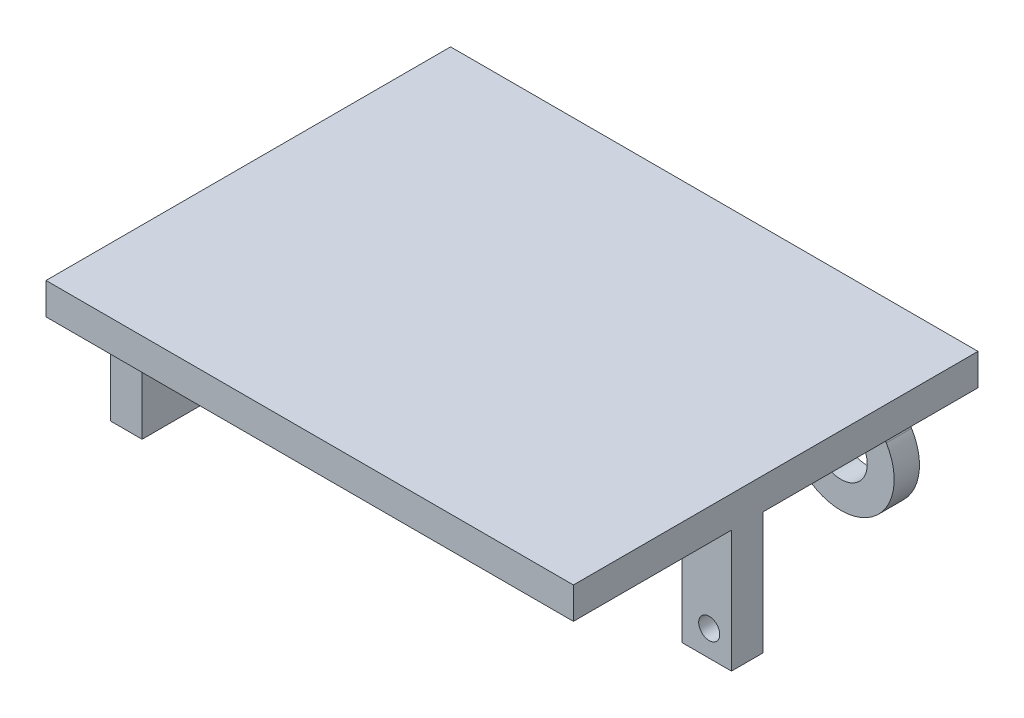
ISO-10303-21;
HEADER;
FILE_DESCRIPTION(('STEP AP214'),'2;1');
FILE_NAME('part.step','',(''),(''),'','','');
FILE_SCHEMA(('AUTOMOTIVE_DESIGN { 1 0 10303 214 1 1 1 1 }'));
ENDSEC;
DATA;
#1=APPLICATION_CONTEXT('core data for automotive mechanical design processes');
#2=APPLICATION_PROTOCOL_DEFINITION('international standard','automotive_design',2000,#1);
#3=PRODUCT_CONTEXT('',#1,'mechanical');
#4=PRODUCT('Part','Part','',(#3));
#5=PRODUCT_RELATED_PRODUCT_CATEGORY('part','',(#4));
#6=PRODUCT_DEFINITION_FORMATION('','',#4);
#7=PRODUCT_DEFINITION_CONTEXT('part definition',#1,'design');
#8=PRODUCT_DEFINITION('design','',#6,#7);
#9=PRODUCT_DEFINITION_SHAPE('','',#8);
#10=(LENGTH_UNIT() NAMED_UNIT(*) SI_UNIT(.MILLI.,.METRE.));
#11=(NAMED_UNIT(*) PLANE_ANGLE_UNIT() SI_UNIT($,.RADIAN.));
#12=(NAMED_UNIT(*) SI_UNIT($,.STERADIAN.) SOLID_ANGLE_UNIT());
#13=UNCERTAINTY_MEASURE_WITH_UNIT(LENGTH_MEASURE(1.E-05),#10,'distance_accuracy_value','');
#14=(GEOMETRIC_REPRESENTATION_CONTEXT(3) GLOBAL_UNCERTAINTY_ASSIGNED_CONTEXT((#13)) GLOBAL_UNIT_ASSIGNED_CONTEXT((#10,
#11,#12)) REPRESENTATION_CONTEXT('',''));
#15=CARTESIAN_POINT('',(0.,0.,0.));
#16=DIRECTION('',(0.,0.,1.));
#17=DIRECTION('',(1.,0.,0.));
#18=AXIS2_PLACEMENT_3D('',#15,#16,#17);
#19=CARTESIAN_POINT('',(0.375600944053645,9.13290377750628,2.4));
#20=DIRECTION('',(0.,1.,0.));
#21=DIRECTION('',(0.,0.,1.));
#22=AXIS2_PLACEMENT_3D('',#19,#20,#21);
#23=PLANE('',#22);
#24=DIRECTION('',(-1.,0.,0.));
#25=VECTOR('',#24,1.);
#26=CARTESIAN_POINT('',(-24.690248118354,9.13290377750628,20.4));
#27=LINE('',#26,#25);
#28=CARTESIAN_POINT('',(-17.6902481183561,9.13290377750628,20.4));
#29=VERTEX_POINT('',#28);
#30=CARTESIAN_POINT('',(-24.690248118354,9.13290377750628,20.4));
#31=VERTEX_POINT('',#30);
#32=EDGE_CURVE('E281',#29,#31,#27,.T.);
#33=ORIENTED_EDGE('',*,*,#32,.T.);
#34=DIRECTION('',(0.,0.,1.));
#35=VECTOR('',#34,1.);
#36=CARTESIAN_POINT('',(-24.690248118354,9.13290377750628,20.4));
#37=LINE('',#36,#35);
#38=CARTESIAN_POINT('',(-24.690248118354,9.13290377750628,23.4));
#39=VERTEX_POINT('',#38);
#40=EDGE_CURVE('E294',#31,#39,#37,.T.);
#41=ORIENTED_EDGE('',*,*,#40,.T.);
#42=DIRECTION('',(-1.,0.,0.));
#43=VECTOR('',#42,1.);
#44=CARTESIAN_POINT('',(-24.690248118354,9.13290377750628,23.4));
#45=LINE('',#44,#43);
#46=CARTESIAN_POINT('',(-17.6902481183561,9.13290377750628,23.4));
#47=VERTEX_POINT('',#46);
#48=EDGE_CURVE('E276',#47,#39,#45,.T.);
#49=ORIENTED_EDGE('',*,*,#48,.F.);
#50=DIRECTION('',(0.,0.,1.));
#51=VECTOR('',#50,1.);
#52=CARTESIAN_POINT('',(-17.6902481183561,9.13290377750628,20.4));
#53=LINE('',#52,#51);
#54=EDGE_CURVE('E298',#29,#47,#53,.T.);
#55=ORIENTED_EDGE('',*,*,#54,.F.);
#56=EDGE_LOOP('',(#33,#41,#49,#55));
#57=FACE_BOUND('',#56,.T.);
#58=DIRECTION('',(-1.,0.,0.));
#59=VECTOR('',#58,1.);
#60=CARTESIAN_POINT('',(-36.4472483248975,9.13290377750629,13.075983));
#61=LINE('',#60,#59);
#62=CARTESIAN_POINT('',(-36.4472483248975,9.13290377750628,13.075983));
#63=VERTEX_POINT('',#62);
#64=CARTESIAN_POINT('',(-39.4472483248975,9.13290377750628,13.075983));
#65=VERTEX_POINT('',#64);
#66=EDGE_CURVE('E55',#63,#65,#61,.T.);
#67=ORIENTED_EDGE('',*,*,#66,.F.);
#68=DIRECTION('',(0.,0.,1.));
#69=VECTOR('',#68,1.);
#70=CARTESIAN_POINT('',(-36.4472483248975,9.13290377750629,6.124016));
#71=LINE('',#70,#69);
#72=CARTESIAN_POINT('',(-36.4472483248975,9.13290377750628,6.12401599999998));
#73=VERTEX_POINT('',#72);
#74=EDGE_CURVE('E60',#73,#63,#71,.T.);
#75=ORIENTED_EDGE('',*,*,#74,.F.);
#76=DIRECTION('',(-1.,0.,0.));
#77=VECTOR('',#76,1.);
#78=CARTESIAN_POINT('',(-36.4472483248975,9.13290377750629,6.124016));
#79=LINE('',#78,#77);
#80=CARTESIAN_POINT('',(-39.4472483248975,9.13290377750629,6.124016));
#81=VERTEX_POINT('',#80);
#82=EDGE_CURVE('E221',#73,#81,#79,.T.);
#83=ORIENTED_EDGE('',*,*,#82,.T.);
#84=DIRECTION('',(0.,0.,-1.));
#85=VECTOR('',#84,1.);
#86=CARTESIAN_POINT('',(-39.4472483248975,9.13290377750628,2.4));
#87=LINE('',#86,#85);
#88=CARTESIAN_POINT('',(-39.4472483248975,9.13290377750628,0.));
#89=VERTEX_POINT('',#88);
#90=EDGE_CURVE('E397',#81,#89,#87,.T.);
#91=ORIENTED_EDGE('',*,*,#90,.T.);
#92=DIRECTION('',(1.,0.,0.));
#93=VECTOR('',#92,1.);
#94=CARTESIAN_POINT('',(-39.4472483248975,9.13290377750628,0.));
#95=LINE('',#94,#93);
#96=CARTESIAN_POINT('',(-13.4706940053491,9.13290377750628,0.));
#97=VERTEX_POINT('',#96);
#98=EDGE_CURVE('E372',#89,#97,#95,.T.);
#99=ORIENTED_EDGE('',*,*,#98,.T.);
#100=DIRECTION('',(0.,0.,-1.));
#101=VECTOR('',#100,1.);
#102=CARTESIAN_POINT('',(-13.4706940053491,9.13290377750628,2.4));
#103=LINE('',#102,#101);
#104=CARTESIAN_POINT('',(-13.4706940053491,9.13290377750628,2.4));
#105=VERTEX_POINT('',#104);
#106=EDGE_CURVE('E394',#105,#97,#103,.T.);
#107=ORIENTED_EDGE('',*,*,#106,.F.);
#108=DIRECTION('',(1.,0.,0.));
#109=VECTOR('',#108,1.);
#110=CARTESIAN_POINT('',(-39.4472483248975,9.13290377750628,2.4));
#111=LINE('',#110,#109);
#112=CARTESIAN_POINT('',(0.375600944053645,9.13290377750628,2.4));
#113=VERTEX_POINT('',#112);
#114=EDGE_CURVE('E11',#105,#113,#111,.T.);
#115=ORIENTED_EDGE('',*,*,#114,.T.);
#116=DIRECTION('',(0.,0.,-1.));
#117=VECTOR('',#116,1.);
#118=CARTESIAN_POINT('',(0.375600944053645,9.13290377750628,2.4));
#119=LINE('',#118,#117);
#120=CARTESIAN_POINT('',(0.375600944053645,9.13290377750628,0.));
#121=VERTEX_POINT('',#120);
#122=EDGE_CURVE('E385',#113,#121,#119,.T.);
#123=ORIENTED_EDGE('',*,*,#122,.T.);
#124=DIRECTION('',(1.,0.,0.));
#125=VECTOR('',#124,1.);
#126=CARTESIAN_POINT('',(0.375600944053645,9.13290377750628,0.));
#127=LINE('',#126,#125);
#128=CARTESIAN_POINT('',(10.6097508816418,9.13290377750628,0.));
#129=VERTEX_POINT('',#128);
#130=EDGE_CURVE('E360',#121,#129,#127,.T.);
#131=ORIENTED_EDGE('',*,*,#130,.T.);
#132=DIRECTION('',(0.,0.,-1.));
#133=VECTOR('',#132,1.);
#134=CARTESIAN_POINT('',(10.6097508816418,9.13290377750628,2.4));
#135=LINE('',#134,#133);
#136=CARTESIAN_POINT('',(10.6097508816418,9.13290377750628,20.4));
#137=VERTEX_POINT('',#136);
#138=EDGE_CURVE('E364',#137,#129,#135,.T.);
#139=ORIENTED_EDGE('',*,*,#138,.F.);
#140=DIRECTION('',(-1.,0.,0.));
#141=VECTOR('',#140,1.);
#142=CARTESIAN_POINT('',(5.90975088164212,9.13290377750628,20.4));
#143=LINE('',#142,#141);
#144=CARTESIAN_POINT('',(5.90975088164212,9.13290377750628,20.4));
#145=VERTEX_POINT('',#144);
#146=EDGE_CURVE('E319',#137,#145,#143,.T.);
#147=ORIENTED_EDGE('',*,*,#146,.T.);
#148=DIRECTION('',(0.,0.,1.));
#149=VECTOR('',#148,1.);
#150=CARTESIAN_POINT('',(5.90975088164212,9.13290377750628,20.4));
#151=LINE('',#150,#149);
#152=CARTESIAN_POINT('',(5.90975088164212,9.13290377750628,23.4));
#153=VERTEX_POINT('',#152);
#154=EDGE_CURVE('E332',#145,#153,#151,.T.);
#155=ORIENTED_EDGE('',*,*,#154,.T.);
#156=DIRECTION('',(-1.,0.,0.));
#157=VECTOR('',#156,1.);
#158=CARTESIAN_POINT('',(5.90975088164212,9.13290377750628,23.4));
#159=LINE('',#158,#157);
#160=CARTESIAN_POINT('',(10.6097508816418,9.13290377750628,23.4));
#161=VERTEX_POINT('',#160);
#162=EDGE_CURVE('E314',#161,#153,#159,.T.);
#163=ORIENTED_EDGE('',*,*,#162,.F.);
#164=CARTESIAN_POINT('',(10.6097508816418,9.13290377750628,38.4));
#165=VERTEX_POINT('',#164);
#166=EDGE_CURVE('E382',#165,#161,#135,.T.);
#167=ORIENTED_EDGE('',*,*,#166,.F.);
#168=DIRECTION('',(1.,0.,0.));
#169=VECTOR('',#168,1.);
#170=CARTESIAN_POINT('',(-39.4472483248975,9.13290377750628,38.4));
#171=LINE('',#170,#169);
#172=CARTESIAN_POINT('',(-39.4472483248975,9.13290377750628,38.4));
#173=VERTEX_POINT('',#172);
#174=EDGE_CURVE('E341',#173,#165,#171,.T.);
#175=ORIENTED_EDGE('',*,*,#174,.F.);
#176=CARTESIAN_POINT('',(-39.4472483248975,9.13290377750628,32.275984));
#177=VERTEX_POINT('',#176);
#178=EDGE_CURVE('E398',#173,#177,#87,.T.);
#179=ORIENTED_EDGE('',*,*,#178,.T.);
#180=DIRECTION('',(-1.,0.,0.));
#181=VECTOR('',#180,1.);
#182=CARTESIAN_POINT('',(-36.4472483248975,9.13290377750628,32.275984));
#183=LINE('',#182,#181);
#184=CARTESIAN_POINT('',(-36.4472483248975,9.13290377750628,32.275984));
#185=VERTEX_POINT('',#184);
#186=EDGE_CURVE('E256',#185,#177,#183,.T.);
#187=ORIENTED_EDGE('',*,*,#186,.F.);
#188=DIRECTION('',(0.,0.,1.));
#189=VECTOR('',#188,1.);
#190=CARTESIAN_POINT('',(-36.4472483248975,9.13290377750628,32.275984));
#191=LINE('',#190,#189);
#192=CARTESIAN_POINT('',(-36.4472483248975,9.13290377750628,25.324017));
#193=VERTEX_POINT('',#192);
#194=EDGE_CURVE('E242',#193,#185,#191,.T.);
#195=ORIENTED_EDGE('',*,*,#194,.F.);
#196=DIRECTION('',(-1.,0.,0.));
#197=VECTOR('',#196,1.);
#198=CARTESIAN_POINT('',(-36.4472483248975,9.13290377750628,25.324017));
#199=LINE('',#198,#197);
#200=CARTESIAN_POINT('',(-39.4472483248975,9.13290377750628,25.324017));
#201=VERTEX_POINT('',#200);
#202=EDGE_CURVE('E259',#193,#201,#199,.T.);
#203=ORIENTED_EDGE('',*,*,#202,.T.);
#204=EDGE_CURVE('E400',#201,#65,#87,.T.);
#205=ORIENTED_EDGE('',*,*,#204,.T.);
#206=EDGE_LOOP('',(#67,#75,#83,#91,#99,#107,#115,#123,#131,#139,#147,#155,#163,#167,#175,#179,
#187,#195,#203,#205));
#207=FACE_BOUND('',#206,.T.);
#208=ADVANCED_FACE('F39',(#57,#207),#23,.F.);
#209=CARTESIAN_POINT('',(-1.02695629777827E-12,-8.59013381260265E-13,2.4));
#210=DIRECTION('',(0.,0.,1.));
#211=DIRECTION('',(1.,0.,0.));
#212=AXIS2_PLACEMENT_3D('',#209,#210,#211);
#213=PLANE('',#212);
#214=ORIENTED_EDGE('',*,*,#114,.F.);
#215=DIRECTION('',(0.616631037907866,-0.787252286810694,0.));
#216=VECTOR('',#215,1.);
#217=CARTESIAN_POINT('',(-13.4706940053491,9.13290377750628,2.4));
#218=LINE('',#217,#216);
#219=CARTESIAN_POINT('',(-3.35801161441651,-3.77794865876277,2.4));
#220=VERTEX_POINT('',#219);
#221=EDGE_CURVE('E357',#105,#220,#218,.T.);
#222=ORIENTED_EDGE('',*,*,#221,.T.);
#223=CARTESIAN_POINT('',(-1.02695629777827E-12,-8.59013381260265E-13,2.4));
#224=DIRECTION('',(0.,0.,1.));
#225=DIRECTION('',(1.,0.,0.));
#226=AXIS2_PLACEMENT_3D('',#223,#224,#225);
#227=CIRCLE('',#226,5.0546155215595);
#228=CARTESIAN_POINT('',(4.30431290479305,2.64991103405545,2.4));
#229=VERTEX_POINT('',#228);
#230=EDGE_CURVE('E359',#220,#229,#227,.T.);
#231=ORIENTED_EDGE('',*,*,#230,.T.);
#232=DIRECTION('',(-0.518265579164981,0.855219731678816,0.));
#233=VECTOR('',#232,1.);
#234=CARTESIAN_POINT('',(4.30431290479305,2.64991103405545,2.4));
#235=LINE('',#234,#233);
#236=EDGE_CURVE('E362',#229,#113,#235,.T.);
#237=ORIENTED_EDGE('',*,*,#236,.T.);
#238=EDGE_LOOP('',(#214,#222,#231,#237));
#239=FACE_BOUND('',#238,.T.);
#240=CARTESIAN_POINT('',(-1.02695629777827E-12,-8.59013381260265E-13,2.4));
#241=DIRECTION('',(0.,0.,1.));
#242=DIRECTION('',(1.,0.,0.));
#243=AXIS2_PLACEMENT_3D('',#240,#241,#242);
#244=CIRCLE('',#243,2.49999999999947);
#245=CARTESIAN_POINT('',(2.49999999999844,-8.59013381260265E-13,2.4));
#246=VERTEX_POINT('',#245);
#247=EDGE_CURVE('E351',#246,#246,#244,.T.);
#248=ORIENTED_EDGE('',*,*,#247,.F.);
#249=EDGE_LOOP('',(#248));
#250=FACE_BOUND('',#249,.T.);
#251=ADVANCED_FACE('F434',(#239,#250),#213,.T.);
#252=CARTESIAN_POINT('',(-1.02695629777827E-12,-8.59013381260265E-13,0.));
#253=DIRECTION('',(0.,0.,1.));
#254=DIRECTION('',(1.,0.,0.));
#255=AXIS2_PLACEMENT_3D('',#252,#253,#254);
#256=PLANE('',#255);
#257=DIRECTION('',(0.,1.,0.));
#258=VECTOR('',#257,1.);
#259=CARTESIAN_POINT('',(10.6097508816418,9.13290377750628,0.));
#260=LINE('',#259,#258);
#261=CARTESIAN_POINT('',(10.6097508816418,12.1289037733501,0.));
#262=VERTEX_POINT('',#261);
#263=EDGE_CURVE('E354',#129,#262,#260,.T.);
#264=ORIENTED_EDGE('',*,*,#263,.F.);
#265=ORIENTED_EDGE('',*,*,#130,.F.);
#266=DIRECTION('',(-0.518265579164981,0.855219731678816,0.));
#267=VECTOR('',#266,1.);
#268=CARTESIAN_POINT('',(4.30431290479305,2.64991103405545,0.));
#269=LINE('',#268,#267);
#270=CARTESIAN_POINT('',(4.30431290479305,2.64991103405545,0.));
#271=VERTEX_POINT('',#270);
#272=EDGE_CURVE('E378',#271,#121,#269,.T.);
#273=ORIENTED_EDGE('',*,*,#272,.F.);
#274=CARTESIAN_POINT('',(-1.02695629777827E-12,-8.59013381260265E-13,0.));
#275=DIRECTION('',(0.,0.,1.));
#276=DIRECTION('',(1.,0.,0.));
#277=AXIS2_PLACEMENT_3D('',#274,#275,#276);
#278=CIRCLE('',#277,5.0546155215595);
#279=CARTESIAN_POINT('',(-3.35801161441651,-3.77794865876277,0.));
#280=VERTEX_POINT('',#279);
#281=EDGE_CURVE('E376',#280,#271,#278,.T.);
#282=ORIENTED_EDGE('',*,*,#281,.F.);
#283=DIRECTION('',(0.616631037907866,-0.787252286810694,0.));
#284=VECTOR('',#283,1.);
#285=CARTESIAN_POINT('',(-13.4706940053491,9.13290377750628,0.));
#286=LINE('',#285,#284);
#287=EDGE_CURVE('E374',#97,#280,#286,.T.);
#288=ORIENTED_EDGE('',*,*,#287,.F.);
#289=ORIENTED_EDGE('',*,*,#98,.F.);
#290=DIRECTION('',(0.,-1.,0.));
#291=VECTOR('',#290,1.);
#292=CARTESIAN_POINT('',(-39.4472483248975,12.1289037733501,0.));
#293=LINE('',#292,#291);
#294=CARTESIAN_POINT('',(-39.4472483248975,12.1289037733501,0.));
#295=VERTEX_POINT('',#294);
#296=EDGE_CURVE('E369',#295,#89,#293,.T.);
#297=ORIENTED_EDGE('',*,*,#296,.F.);
#298=DIRECTION('',(-1.,0.,0.));
#299=VECTOR('',#298,1.);
#300=CARTESIAN_POINT('',(-39.4472483248975,12.1289037733501,0.));
#301=LINE('',#300,#299);
#302=EDGE_CURVE('E367',#262,#295,#301,.T.);
#303=ORIENTED_EDGE('',*,*,#302,.F.);
#304=EDGE_LOOP('',(#264,#265,#273,#282,#288,#289,#297,#303));
#305=FACE_BOUND('',#304,.T.);
#306=CARTESIAN_POINT('',(-1.02695629777827E-12,-8.59013381260265E-13,0.));
#307=DIRECTION('',(0.,0.,1.));
#308=DIRECTION('',(1.,0.,0.));
#309=AXIS2_PLACEMENT_3D('',#306,#307,#308);
#310=CIRCLE('',#309,2.49999999999947);
#311=CARTESIAN_POINT('',(2.49999999999844,-8.59013381260265E-13,0.));
#312=VERTEX_POINT('',#311);
#313=EDGE_CURVE('E349',#312,#312,#310,.T.);
#314=ORIENTED_EDGE('',*,*,#313,.T.);
#315=EDGE_LOOP('',(#314));
#316=FACE_BOUND('',#315,.T.);
#317=ADVANCED_FACE('F415',(#305,#316),#256,.F.);
#318=CARTESIAN_POINT('',(10.6097508816418,9.13290377750628,2.4));
#319=DIRECTION('',(-1.,0.,0.));
#320=DIRECTION('',(0.,0.,1.));
#321=AXIS2_PLACEMENT_3D('',#318,#319,#320);
#322=PLANE('',#321);
#323=ORIENTED_EDGE('',*,*,#263,.T.);
#324=DIRECTION('',(0.,0.,-1.));
#325=VECTOR('',#324,1.);
#326=CARTESIAN_POINT('',(10.6097508816418,12.1289037733501,2.4));
#327=LINE('',#326,#325);
#328=CARTESIAN_POINT('',(10.6097508816418,12.1289037733501,38.4));
#329=VERTEX_POINT('',#328);
#330=EDGE_CURVE('E43',#329,#262,#327,.T.);
#331=ORIENTED_EDGE('',*,*,#330,.F.);
#332=DIRECTION('',(0.,1.,0.));
#333=VECTOR('',#332,1.);
#334=CARTESIAN_POINT('',(10.6097508816418,9.13290377750628,38.4));
#335=LINE('',#334,#333);
#336=EDGE_CURVE('E344',#165,#329,#335,.T.);
#337=ORIENTED_EDGE('',*,*,#336,.F.);
#338=ORIENTED_EDGE('',*,*,#166,.T.);
#339=DIRECTION('',(0.,1.,0.));
#340=VECTOR('',#339,1.);
#341=CARTESIAN_POINT('',(10.6097508816418,9.13290377750628,23.4));
#342=LINE('',#341,#340);
#343=CARTESIAN_POINT('',(10.6097508816418,-2.45709622249371,23.4));
#344=VERTEX_POINT('',#343);
#345=EDGE_CURVE('E328',#344,#161,#342,.T.);
#346=ORIENTED_EDGE('',*,*,#345,.F.);
#347=DIRECTION('',(0.,0.,1.));
#348=VECTOR('',#347,1.);
#349=CARTESIAN_POINT('',(10.6097508816418,-2.45709622249371,20.4));
#350=LINE('',#349,#348);
#351=CARTESIAN_POINT('',(10.6097508816418,-2.45709622249371,20.4));
#352=VERTEX_POINT('',#351);
#353=EDGE_CURVE('E336',#352,#344,#350,.T.);
#354=ORIENTED_EDGE('',*,*,#353,.F.);
#355=DIRECTION('',(0.,1.,0.));
#356=VECTOR('',#355,1.);
#357=CARTESIAN_POINT('',(10.6097508816418,9.13290377750628,20.4));
#358=LINE('',#357,#356);
#359=EDGE_CURVE('E317',#352,#137,#358,.T.);
#360=ORIENTED_EDGE('',*,*,#359,.T.);
#361=ORIENTED_EDGE('',*,*,#138,.T.);
#362=EDGE_LOOP('',(#323,#331,#337,#338,#346,#354,#360,#361));
#363=FACE_BOUND('',#362,.T.);
#364=ADVANCED_FACE('F41',(#363),#322,.F.);
#365=CARTESIAN_POINT('',(-39.4472483248975,12.1289037733501,2.4));
#366=DIRECTION('',(0.,-1.,0.));
#367=DIRECTION('',(0.,0.,-1.));
#368=AXIS2_PLACEMENT_3D('',#365,#366,#367);
#369=PLANE('',#368);
#370=ORIENTED_EDGE('',*,*,#302,.T.);
#371=DIRECTION('',(0.,0.,-1.));
#372=VECTOR('',#371,1.);
#373=CARTESIAN_POINT('',(-39.4472483248975,12.1289037733501,2.4));
#374=LINE('',#373,#372);
#375=CARTESIAN_POINT('',(-39.4472483248975,12.1289037733501,38.4));
#376=VERTEX_POINT('',#375);
#377=EDGE_CURVE('E399',#376,#295,#374,.T.);
#378=ORIENTED_EDGE('',*,*,#377,.F.);
#379=DIRECTION('',(-1.,0.,0.));
#380=VECTOR('',#379,1.);
#381=CARTESIAN_POINT('',(10.6097508816418,12.1289037733501,38.4));
#382=LINE('',#381,#380);
#383=EDGE_CURVE('E347',#329,#376,#382,.T.);
#384=ORIENTED_EDGE('',*,*,#383,.F.);
#385=ORIENTED_EDGE('',*,*,#330,.T.);
#386=EDGE_LOOP('',(#370,#378,#384,#385));
#387=FACE_BOUND('',#386,.T.);
#388=ADVANCED_FACE('F408',(#387),#369,.F.);
#389=CARTESIAN_POINT('',(-39.4472483248975,12.1289037733501,2.4));
#390=DIRECTION('',(1.,0.,0.));
#391=DIRECTION('',(0.,0.,-1.));
#392=AXIS2_PLACEMENT_3D('',#389,#390,#391);
#393=PLANE('',#392);
#394=ORIENTED_EDGE('',*,*,#296,.T.);
#395=ORIENTED_EDGE('',*,*,#90,.F.);
#396=DIRECTION('',(0.,1.,0.));
#397=VECTOR('',#396,1.);
#398=CARTESIAN_POINT('',(-39.4472483248975,-2.49109835249372,6.12401599999998));
#399=LINE('',#398,#397);
#400=CARTESIAN_POINT('',(-39.4472483248975,-2.49109835249372,6.12401599999998));
#401=VERTEX_POINT('',#400);
#402=EDGE_CURVE('E228',#401,#81,#399,.T.);
#403=ORIENTED_EDGE('',*,*,#402,.F.);
#404=DIRECTION('',(0.,0.,-1.));
#405=VECTOR('',#404,1.);
#406=CARTESIAN_POINT('',(-39.4472483248975,-2.49109835249372,13.075983));
#407=LINE('',#406,#405);
#408=CARTESIAN_POINT('',(-39.4472483248975,-2.49109835249372,13.075983));
#409=VERTEX_POINT('',#408);
#410=EDGE_CURVE('E226',#409,#401,#407,.T.);
#411=ORIENTED_EDGE('',*,*,#410,.F.);
#412=DIRECTION('',(0.,-1.,0.));
#413=VECTOR('',#412,1.);
#414=CARTESIAN_POINT('',(-39.4472483248975,-2.49109835249372,13.075983));
#415=LINE('',#414,#413);
#416=EDGE_CURVE('E211',#65,#409,#415,.T.);
#417=ORIENTED_EDGE('',*,*,#416,.F.);
#418=ORIENTED_EDGE('',*,*,#204,.F.);
#419=DIRECTION('',(0.,1.,0.));
#420=VECTOR('',#419,1.);
#421=CARTESIAN_POINT('',(-39.4472483248975,-2.49109835249372,25.324017));
#422=LINE('',#421,#420);
#423=CARTESIAN_POINT('',(-39.4472483248975,-2.49109835249372,25.324017));
#424=VERTEX_POINT('',#423);
#425=EDGE_CURVE('E250',#424,#201,#422,.T.);
#426=ORIENTED_EDGE('',*,*,#425,.F.);
#427=DIRECTION('',(0.,0.,-1.));
#428=VECTOR('',#427,1.);
#429=CARTESIAN_POINT('',(-39.4472483248975,-2.49109835249372,32.275984));
#430=LINE('',#429,#428);
#431=CARTESIAN_POINT('',(-39.4472483248975,-2.49109835249372,32.275984));
#432=VERTEX_POINT('',#431);
#433=EDGE_CURVE('E234',#432,#424,#430,.T.);
#434=ORIENTED_EDGE('',*,*,#433,.F.);
#435=DIRECTION('',(0.,-1.,0.));
#436=VECTOR('',#435,1.);
#437=CARTESIAN_POINT('',(-39.4472483248975,-2.49109835249372,32.275984));
#438=LINE('',#437,#436);
#439=EDGE_CURVE('E239',#177,#432,#438,.T.);
#440=ORIENTED_EDGE('',*,*,#439,.F.);
#441=ORIENTED_EDGE('',*,*,#178,.F.);
#442=DIRECTION('',(0.,-1.,0.));
#443=VECTOR('',#442,1.);
#444=CARTESIAN_POINT('',(-39.4472483248975,12.1289037733501,38.4));
#445=LINE('',#444,#443);
#446=EDGE_CURVE('E335',#376,#173,#445,.T.);
#447=ORIENTED_EDGE('',*,*,#446,.F.);
#448=ORIENTED_EDGE('',*,*,#377,.T.);
#449=EDGE_LOOP('',(#394,#395,#403,#411,#417,#418,#426,#434,#440,#441,#447,#448));
#450=FACE_BOUND('',#449,.T.);
#451=ADVANCED_FACE('F420',(#450),#393,.F.);
#452=CARTESIAN_POINT('',(-13.4706940053491,9.13290377750628,2.4));
#453=DIRECTION('',(0.787252286810694,0.616631037907866,0.));
#454=DIRECTION('',(-0.616631037907866,0.787252286810694,0.));
#455=AXIS2_PLACEMENT_3D('',#452,#453,#454);
#456=PLANE('',#455);
#457=ORIENTED_EDGE('',*,*,#287,.T.);
#458=DIRECTION('',(0.,0.,-1.));
#459=VECTOR('',#458,1.);
#460=CARTESIAN_POINT('',(-3.35801161441651,-3.77794865876277,2.4));
#461=LINE('',#460,#459);
#462=EDGE_CURVE('E391',#220,#280,#461,.T.);
#463=ORIENTED_EDGE('',*,*,#462,.F.);
#464=ORIENTED_EDGE('',*,*,#221,.F.);
#465=ORIENTED_EDGE('',*,*,#106,.T.);
#466=EDGE_LOOP('',(#457,#463,#464,#465));
#467=FACE_BOUND('',#466,.T.);
#468=ADVANCED_FACE('F454',(#467),#456,.F.);
#469=CARTESIAN_POINT('',(-1.02695629777827E-12,-8.59013381260265E-13,2.4));
#470=DIRECTION('',(0.,0.,-1.));
#471=DIRECTION('',(-1.,0.,0.));
#472=AXIS2_PLACEMENT_3D('',#469,#470,#471);
#473=CYLINDRICAL_SURFACE('',#472,5.0546155215595);
#474=ORIENTED_EDGE('',*,*,#281,.T.);
#475=DIRECTION('',(0.,0.,-1.));
#476=VECTOR('',#475,1.);
#477=CARTESIAN_POINT('',(4.30431290479305,2.64991103405545,2.4));
#478=LINE('',#477,#476);
#479=EDGE_CURVE('E388',#229,#271,#478,.T.);
#480=ORIENTED_EDGE('',*,*,#479,.F.);
#481=ORIENTED_EDGE('',*,*,#230,.F.);
#482=ORIENTED_EDGE('',*,*,#462,.T.);
#483=EDGE_LOOP('',(#474,#480,#481,#482));
#484=FACE_BOUND('',#483,.T.);
#485=ADVANCED_FACE('F450',(#484),#473,.T.);
#486=CARTESIAN_POINT('',(4.30431290479305,2.64991103405545,2.4));
#487=DIRECTION('',(-0.855219731678816,-0.518265579164981,0.));
#488=DIRECTION('',(0.518265579164981,-0.855219731678817,0.));
#489=AXIS2_PLACEMENT_3D('',#486,#487,#488);
#490=PLANE('',#489);
#491=ORIENTED_EDGE('',*,*,#272,.T.);
#492=ORIENTED_EDGE('',*,*,#122,.F.);
#493=ORIENTED_EDGE('',*,*,#236,.F.);
#494=ORIENTED_EDGE('',*,*,#479,.T.);
#495=EDGE_LOOP('',(#491,#492,#493,#494));
#496=FACE_BOUND('',#495,.T.);
#497=ADVANCED_FACE('F446',(#496),#490,.F.);
#498=CARTESIAN_POINT('',(-1.02695629777827E-12,-8.59013381260265E-13,2.4));
#499=DIRECTION('',(0.,0.,-1.));
#500=DIRECTION('',(-1.,0.,0.));
#501=AXIS2_PLACEMENT_3D('',#498,#499,#500);
#502=CYLINDRICAL_SURFACE('',#501,2.49999999999947);
#503=ORIENTED_EDGE('',*,*,#247,.T.);
#504=EDGE_LOOP('',(#503));
#505=FACE_BOUND('',#504,.T.);
#506=ORIENTED_EDGE('',*,*,#313,.F.);
#507=EDGE_LOOP('',(#506));
#508=FACE_BOUND('',#507,.T.);
#509=ADVANCED_FACE('F449',(#505,#508),#502,.F.);
#510=CARTESIAN_POINT('',(0.,0.,38.4));
#511=DIRECTION('',(0.,0.,1.));
#512=DIRECTION('',(1.,0.,0.));
#513=AXIS2_PLACEMENT_3D('',#510,#511,#512);
#514=PLANE('',#513);
#515=ORIENTED_EDGE('',*,*,#446,.T.);
#516=ORIENTED_EDGE('',*,*,#174,.T.);
#517=ORIENTED_EDGE('',*,*,#336,.T.);
#518=ORIENTED_EDGE('',*,*,#383,.T.);
#519=EDGE_LOOP('',(#515,#516,#517,#518));
#520=FACE_BOUND('',#519,.T.);
#521=ADVANCED_FACE('F485',(#520),#514,.T.);
#522=CARTESIAN_POINT('',(5.90975088164212,9.13290377750628,20.4));
#523=DIRECTION('',(-1.,0.,0.));
#524=DIRECTION('',(0.,-1.,0.));
#525=AXIS2_PLACEMENT_3D('',#522,#523,#524);
#526=PLANE('',#525);
#527=DIRECTION('',(0.,-1.,0.));
#528=VECTOR('',#527,1.);
#529=CARTESIAN_POINT('',(5.90975088164212,9.13290377750628,23.4));
#530=LINE('',#529,#528);
#531=CARTESIAN_POINT('',(5.90975088164213,-2.45709622249371,23.4));
#532=VERTEX_POINT('',#531);
#533=EDGE_CURVE('E307',#153,#532,#530,.T.);
#534=ORIENTED_EDGE('',*,*,#533,.F.);
#535=ORIENTED_EDGE('',*,*,#154,.F.);
#536=DIRECTION('',(0.,-1.,0.));
#537=VECTOR('',#536,1.);
#538=CARTESIAN_POINT('',(5.90975088164212,9.13290377750628,20.4));
#539=LINE('',#538,#537);
#540=CARTESIAN_POINT('',(5.90975088164213,-2.45709622249371,20.4));
#541=VERTEX_POINT('',#540);
#542=EDGE_CURVE('E310',#145,#541,#539,.T.);
#543=ORIENTED_EDGE('',*,*,#542,.T.);
#544=DIRECTION('',(0.,0.,1.));
#545=VECTOR('',#544,1.);
#546=CARTESIAN_POINT('',(5.90975088164213,-2.45709622249371,20.4));
#547=LINE('',#546,#545);
#548=EDGE_CURVE('E322',#541,#532,#547,.T.);
#549=ORIENTED_EDGE('',*,*,#548,.T.);
#550=EDGE_LOOP('',(#534,#535,#543,#549));
#551=FACE_BOUND('',#550,.T.);
#552=ADVANCED_FACE('F527',(#551),#526,.T.);
#553=CARTESIAN_POINT('',(5.90975088164213,-2.45709622249371,20.4));
#554=DIRECTION('',(0.,-1.,0.));
#555=DIRECTION('',(1.,0.,0.));
#556=AXIS2_PLACEMENT_3D('',#553,#554,#555);
#557=PLANE('',#556);
#558=DIRECTION('',(1.,0.,0.));
#559=VECTOR('',#558,1.);
#560=CARTESIAN_POINT('',(5.90975088164213,-2.45709622249371,23.4));
#561=LINE('',#560,#559);
#562=EDGE_CURVE('E325',#532,#344,#561,.T.);
#563=ORIENTED_EDGE('',*,*,#562,.F.);
#564=ORIENTED_EDGE('',*,*,#548,.F.);
#565=DIRECTION('',(1.,0.,0.));
#566=VECTOR('',#565,1.);
#567=CARTESIAN_POINT('',(5.90975088164213,-2.45709622249371,20.4));
#568=LINE('',#567,#566);
#569=EDGE_CURVE('E313',#541,#352,#568,.T.);
#570=ORIENTED_EDGE('',*,*,#569,.T.);
#571=ORIENTED_EDGE('',*,*,#353,.T.);
#572=EDGE_LOOP('',(#563,#564,#570,#571));
#573=FACE_BOUND('',#572,.T.);
#574=ADVANCED_FACE('F535',(#573),#557,.T.);
#575=CARTESIAN_POINT('',(0.,0.,20.4));
#576=DIRECTION('',(0.,0.,1.));
#577=DIRECTION('',(1.,0.,0.));
#578=AXIS2_PLACEMENT_3D('',#575,#576,#577);
#579=PLANE('',#578);
#580=CARTESIAN_POINT('',(8.49999999987004,-9.15933995315754E-13,20.4));
#581=DIRECTION('',(0.,0.,1.));
#582=DIRECTION('',(1.,0.,0.));
#583=AXIS2_PLACEMENT_3D('',#580,#581,#582);
#584=CIRCLE('',#583,1.00000000000377);
#585=CARTESIAN_POINT('',(9.49999999987382,-9.15933995315754E-13,20.4));
#586=VERTEX_POINT('',#585);
#587=EDGE_CURVE('E304',#586,#586,#584,.T.);
#588=ORIENTED_EDGE('',*,*,#587,.T.);
#589=EDGE_LOOP('',(#588));
#590=FACE_BOUND('',#589,.T.);
#591=ORIENTED_EDGE('',*,*,#542,.F.);
#592=ORIENTED_EDGE('',*,*,#146,.F.);
#593=ORIENTED_EDGE('',*,*,#359,.F.);
#594=ORIENTED_EDGE('',*,*,#569,.F.);
#595=EDGE_LOOP('',(#591,#592,#593,#594));
#596=FACE_BOUND('',#595,.T.);
#597=ADVANCED_FACE('F544',(#590,#596),#579,.F.);
#598=CARTESIAN_POINT('',(0.,0.,23.4));
#599=DIRECTION('',(0.,0.,1.));
#600=DIRECTION('',(1.,0.,0.));
#601=AXIS2_PLACEMENT_3D('',#598,#599,#600);
#602=PLANE('',#601);
#603=CARTESIAN_POINT('',(8.49999999987004,-9.15933995315754E-13,23.4));
#604=DIRECTION('',(0.,0.,1.));
#605=DIRECTION('',(1.,0.,0.));
#606=AXIS2_PLACEMENT_3D('',#603,#604,#605);
#607=CIRCLE('',#606,1.00000000000377);
#608=CARTESIAN_POINT('',(9.49999999987382,-9.15933995315754E-13,23.4));
#609=VERTEX_POINT('',#608);
#610=EDGE_CURVE('E297',#609,#609,#607,.T.);
#611=ORIENTED_EDGE('',*,*,#610,.F.);
#612=EDGE_LOOP('',(#611));
#613=FACE_BOUND('',#612,.T.);
#614=ORIENTED_EDGE('',*,*,#533,.T.);
#615=ORIENTED_EDGE('',*,*,#562,.T.);
#616=ORIENTED_EDGE('',*,*,#345,.T.);
#617=ORIENTED_EDGE('',*,*,#162,.T.);
#618=EDGE_LOOP('',(#614,#615,#616,#617));
#619=FACE_BOUND('',#618,.T.);
#620=ADVANCED_FACE('F553',(#613,#619),#602,.T.);
#621=CARTESIAN_POINT('',(8.49999999987004,-9.15933995315754E-13,20.4));
#622=DIRECTION('',(0.,0.,1.));
#623=DIRECTION('',(1.,0.,0.));
#624=AXIS2_PLACEMENT_3D('',#621,#622,#623);
#625=CYLINDRICAL_SURFACE('',#624,1.00000000000377);
#626=ORIENTED_EDGE('',*,*,#587,.F.);
#627=EDGE_LOOP('',(#626));
#628=FACE_BOUND('',#627,.T.);
#629=ORIENTED_EDGE('',*,*,#610,.T.);
#630=EDGE_LOOP('',(#629));
#631=FACE_BOUND('',#630,.T.);
#632=ADVANCED_FACE('F562',(#628,#631),#625,.F.);
#633=CARTESIAN_POINT('',(-24.690248118354,9.13290377750628,20.4));
#634=DIRECTION('',(-1.,0.,0.));
#635=DIRECTION('',(0.,0.,1.));
#636=AXIS2_PLACEMENT_3D('',#633,#634,#635);
#637=PLANE('',#636);
#638=DIRECTION('',(0.,-1.,0.));
#639=VECTOR('',#638,1.);
#640=CARTESIAN_POINT('',(-24.690248118354,9.13290377750628,23.4));
#641=LINE('',#640,#639);
#642=CARTESIAN_POINT('',(-24.690248118354,-2.4601006024936,23.4));
#643=VERTEX_POINT('',#642);
#644=EDGE_CURVE('E269',#39,#643,#641,.T.);
#645=ORIENTED_EDGE('',*,*,#644,.F.);
#646=ORIENTED_EDGE('',*,*,#40,.F.);
#647=DIRECTION('',(0.,-1.,0.));
#648=VECTOR('',#647,1.);
#649=CARTESIAN_POINT('',(-24.690248118354,9.13290377750628,20.4));
#650=LINE('',#649,#648);
#651=CARTESIAN_POINT('',(-24.690248118354,-2.4601006024936,20.4));
#652=VERTEX_POINT('',#651);
#653=EDGE_CURVE('E272',#31,#652,#650,.T.);
#654=ORIENTED_EDGE('',*,*,#653,.T.);
#655=DIRECTION('',(0.,0.,1.));
#656=VECTOR('',#655,1.);
#657=CARTESIAN_POINT('',(-24.690248118354,-2.4601006024936,20.4));
#658=LINE('',#657,#656);
#659=EDGE_CURVE('E284',#652,#643,#658,.T.);
#660=ORIENTED_EDGE('',*,*,#659,.T.);
#661=EDGE_LOOP('',(#645,#646,#654,#660));
#662=FACE_BOUND('',#661,.T.);
#663=ADVANCED_FACE('F571',(#662),#637,.T.);
#664=CARTESIAN_POINT('',(-17.6902481183561,9.13290377750628,20.4));
#665=DIRECTION('',(1.,0.,0.));
#666=DIRECTION('',(0.,0.,-1.));
#667=AXIS2_PLACEMENT_3D('',#664,#665,#666);
#668=PLANE('',#667);
#669=DIRECTION('',(0.,1.,0.));
#670=VECTOR('',#669,1.);
#671=CARTESIAN_POINT('',(-17.6902481183561,9.13290377750628,23.4));
#672=LINE('',#671,#670);
#673=CARTESIAN_POINT('',(-17.6902481183561,-2.4601006024936,23.4));
#674=VERTEX_POINT('',#673);
#675=EDGE_CURVE('E290',#674,#47,#672,.T.);
#676=ORIENTED_EDGE('',*,*,#675,.F.);
#677=DIRECTION('',(0.,0.,1.));
#678=VECTOR('',#677,1.);
#679=CARTESIAN_POINT('',(-17.6902481183561,-2.4601006024936,20.4));
#680=LINE('',#679,#678);
#681=CARTESIAN_POINT('',(-17.6902481183561,-2.4601006024936,20.4));
#682=VERTEX_POINT('',#681);
#683=EDGE_CURVE('E301',#682,#674,#680,.T.);
#684=ORIENTED_EDGE('',*,*,#683,.F.);
#685=DIRECTION('',(0.,1.,0.));
#686=VECTOR('',#685,1.);
#687=CARTESIAN_POINT('',(-17.6902481183561,9.13290377750628,20.4));
#688=LINE('',#687,#686);
#689=EDGE_CURVE('E279',#682,#29,#688,.T.);
#690=ORIENTED_EDGE('',*,*,#689,.T.);
#691=ORIENTED_EDGE('',*,*,#54,.T.);
#692=EDGE_LOOP('',(#676,#684,#690,#691));
#693=FACE_BOUND('',#692,.T.);
#694=ADVANCED_FACE('F580',(#693),#668,.T.);
#695=CARTESIAN_POINT('',(-24.690248118354,-2.4601006024936,20.4));
#696=DIRECTION('',(0.,-1.,0.));
#697=DIRECTION('',(0.,0.,-1.));
#698=AXIS2_PLACEMENT_3D('',#695,#696,#697);
#699=PLANE('',#698);
#700=DIRECTION('',(1.,0.,0.));
#701=VECTOR('',#700,1.);
#702=CARTESIAN_POINT('',(-24.690248118354,-2.4601006024936,23.4));
#703=LINE('',#702,#701);
#704=EDGE_CURVE('E287',#643,#674,#703,.T.);
#705=ORIENTED_EDGE('',*,*,#704,.F.);
#706=ORIENTED_EDGE('',*,*,#659,.F.);
#707=DIRECTION('',(1.,0.,0.));
#708=VECTOR('',#707,1.);
#709=CARTESIAN_POINT('',(-24.690248118354,-2.4601006024936,20.4));
#710=LINE('',#709,#708);
#711=EDGE_CURVE('E275',#652,#682,#710,.T.);
#712=ORIENTED_EDGE('',*,*,#711,.T.);
#713=ORIENTED_EDGE('',*,*,#683,.T.);
#714=EDGE_LOOP('',(#705,#706,#712,#713));
#715=FACE_BOUND('',#714,.T.);
#716=ADVANCED_FACE('F589',(#715),#699,.T.);
#717=CARTESIAN_POINT('',(0.,0.,20.4));
#718=DIRECTION('',(0.,0.,1.));
#719=DIRECTION('',(1.,0.,0.));
#720=AXIS2_PLACEMENT_3D('',#717,#718,#719);
#721=PLANE('',#720);
#722=CARTESIAN_POINT('',(-19.5000000001287,-9.15933995315754E-13,20.4));
#723=DIRECTION('',(0.,0.,1.));
#724=DIRECTION('',(1.,0.,0.));
#725=AXIS2_PLACEMENT_3D('',#722,#723,#724);
#726=CIRCLE('',#725,0.999999999996459);
#727=CARTESIAN_POINT('',(-18.5000000001322,-9.15933995315754E-13,20.4));
#728=VERTEX_POINT('',#727);
#729=EDGE_CURVE('E266',#728,#728,#726,.T.);
#730=ORIENTED_EDGE('',*,*,#729,.T.);
#731=EDGE_LOOP('',(#730));
#732=FACE_BOUND('',#731,.T.);
#733=ORIENTED_EDGE('',*,*,#653,.F.);
#734=ORIENTED_EDGE('',*,*,#32,.F.);
#735=ORIENTED_EDGE('',*,*,#689,.F.);
#736=ORIENTED_EDGE('',*,*,#711,.F.);
#737=EDGE_LOOP('',(#733,#734,#735,#736));
#738=FACE_BOUND('',#737,.T.);
#739=ADVANCED_FACE('F598',(#732,#738),#721,.F.);
#740=CARTESIAN_POINT('',(0.,0.,23.4));
#741=DIRECTION('',(0.,0.,1.));
#742=DIRECTION('',(1.,0.,0.));
#743=AXIS2_PLACEMENT_3D('',#740,#741,#742);
#744=PLANE('',#743);
#745=CARTESIAN_POINT('',(-19.5000000001287,-9.15933995315754E-13,23.4));
#746=DIRECTION('',(0.,0.,1.));
#747=DIRECTION('',(1.,0.,0.));
#748=AXIS2_PLACEMENT_3D('',#745,#746,#747);
#749=CIRCLE('',#748,0.999999999996459);
#750=CARTESIAN_POINT('',(-18.5000000001322,-9.15933995315754E-13,23.4));
#751=VERTEX_POINT('',#750);
#752=EDGE_CURVE('E265',#751,#751,#749,.T.);
#753=ORIENTED_EDGE('',*,*,#752,.F.);
#754=EDGE_LOOP('',(#753));
#755=FACE_BOUND('',#754,.T.);
#756=ORIENTED_EDGE('',*,*,#644,.T.);
#757=ORIENTED_EDGE('',*,*,#704,.T.);
#758=ORIENTED_EDGE('',*,*,#675,.T.);
#759=ORIENTED_EDGE('',*,*,#48,.T.);
#760=EDGE_LOOP('',(#756,#757,#758,#759));
#761=FACE_BOUND('',#760,.T.);
#762=ADVANCED_FACE('F607',(#755,#761),#744,.T.);
#763=CARTESIAN_POINT('',(-19.5000000001287,-9.15933995315754E-13,20.4));
#764=DIRECTION('',(0.,0.,1.));
#765=DIRECTION('',(1.,0.,0.));
#766=AXIS2_PLACEMENT_3D('',#763,#764,#765);
#767=CYLINDRICAL_SURFACE('',#766,0.999999999996459);
#768=ORIENTED_EDGE('',*,*,#729,.F.);
#769=EDGE_LOOP('',(#768));
#770=FACE_BOUND('',#769,.T.);
#771=ORIENTED_EDGE('',*,*,#752,.T.);
#772=EDGE_LOOP('',(#771));
#773=FACE_BOUND('',#772,.T.);
#774=ADVANCED_FACE('F616',(#770,#773),#767,.F.);
#775=CARTESIAN_POINT('',(-36.4472483248975,-2.49109835249372,32.275984));
#776=DIRECTION('',(0.,1.,0.));
#777=DIRECTION('',(0.,0.,1.));
#778=AXIS2_PLACEMENT_3D('',#775,#776,#777);
#779=PLANE('',#778);
#780=ORIENTED_EDGE('',*,*,#433,.T.);
#781=DIRECTION('',(-1.,0.,0.));
#782=VECTOR('',#781,1.);
#783=CARTESIAN_POINT('',(-36.4472483248975,-2.49109835249372,25.324017));
#784=LINE('',#783,#782);
#785=CARTESIAN_POINT('',(-36.4472483248975,-2.49109835249372,25.324017));
#786=VERTEX_POINT('',#785);
#787=EDGE_CURVE('E262',#786,#424,#784,.T.);
#788=ORIENTED_EDGE('',*,*,#787,.F.);
#789=DIRECTION('',(0.,0.,-1.));
#790=VECTOR('',#789,1.);
#791=CARTESIAN_POINT('',(-36.4472483248975,-2.49109835249372,32.275984));
#792=LINE('',#791,#790);
#793=CARTESIAN_POINT('',(-36.4472483248975,-2.49109835249372,32.275984));
#794=VERTEX_POINT('',#793);
#795=EDGE_CURVE('E235',#794,#786,#792,.T.);
#796=ORIENTED_EDGE('',*,*,#795,.F.);
#797=DIRECTION('',(-1.,0.,0.));
#798=VECTOR('',#797,1.);
#799=CARTESIAN_POINT('',(-36.4472483248975,-2.49109835249372,32.275984));
#800=LINE('',#799,#798);
#801=EDGE_CURVE('E247',#794,#432,#800,.T.);
#802=ORIENTED_EDGE('',*,*,#801,.T.);
#803=EDGE_LOOP('',(#780,#788,#796,#802));
#804=FACE_BOUND('',#803,.T.);
#805=ADVANCED_FACE('F624',(#804),#779,.F.);
#806=CARTESIAN_POINT('',(-36.4472483248975,-2.49109835249372,25.324017));
#807=DIRECTION('',(0.,0.,1.));
#808=DIRECTION('',(0.,-1.,0.));
#809=AXIS2_PLACEMENT_3D('',#806,#807,#808);
#810=PLANE('',#809);
#811=ORIENTED_EDGE('',*,*,#425,.T.);
#812=ORIENTED_EDGE('',*,*,#202,.F.);
#813=DIRECTION('',(0.,1.,0.));
#814=VECTOR('',#813,1.);
#815=CARTESIAN_POINT('',(-36.4472483248975,-2.49109835249372,25.324017));
#816=LINE('',#815,#814);
#817=EDGE_CURVE('E238',#786,#193,#816,.T.);
#818=ORIENTED_EDGE('',*,*,#817,.F.);
#819=ORIENTED_EDGE('',*,*,#787,.T.);
#820=EDGE_LOOP('',(#811,#812,#818,#819));
#821=FACE_BOUND('',#820,.T.);
#822=ADVANCED_FACE('F639',(#821),#810,.F.);
#823=CARTESIAN_POINT('',(-36.4472483248975,-2.49109835249372,32.275984));
#824=DIRECTION('',(0.,0.,-1.));
#825=DIRECTION('',(-1.,0.,0.));
#826=AXIS2_PLACEMENT_3D('',#823,#824,#825);
#827=PLANE('',#826);
#828=ORIENTED_EDGE('',*,*,#439,.T.);
#829=ORIENTED_EDGE('',*,*,#801,.F.);
#830=DIRECTION('',(0.,-1.,0.));
#831=VECTOR('',#830,1.);
#832=CARTESIAN_POINT('',(-36.4472483248975,-2.49109835249372,32.275984));
#833=LINE('',#832,#831);
#834=EDGE_CURVE('E245',#185,#794,#833,.T.);
#835=ORIENTED_EDGE('',*,*,#834,.F.);
#836=ORIENTED_EDGE('',*,*,#186,.T.);
#837=EDGE_LOOP('',(#828,#829,#835,#836));
#838=FACE_BOUND('',#837,.T.);
#839=ADVANCED_FACE('F649',(#838),#827,.F.);
#840=CARTESIAN_POINT('',(-36.4472483248975,0.,0.));
#841=DIRECTION('',(1.,0.,0.));
#842=DIRECTION('',(0.,0.,-1.));
#843=AXIS2_PLACEMENT_3D('',#840,#841,#842);
#844=PLANE('',#843);
#845=ORIENTED_EDGE('',*,*,#795,.T.);
#846=ORIENTED_EDGE('',*,*,#817,.T.);
#847=ORIENTED_EDGE('',*,*,#194,.T.);
#848=ORIENTED_EDGE('',*,*,#834,.T.);
#849=EDGE_LOOP('',(#845,#846,#847,#848));
#850=FACE_BOUND('',#849,.T.);
#851=ADVANCED_FACE('F658',(#850),#844,.T.);
#852=CARTESIAN_POINT('',(-36.4472483248975,-2.49109835249372,13.075983));
#853=DIRECTION('',(0.,0.,-1.));
#854=DIRECTION('',(-1.,0.,0.));
#855=AXIS2_PLACEMENT_3D('',#852,#853,#854);
#856=PLANE('',#855);
#857=ORIENTED_EDGE('',*,*,#416,.T.);
#858=DIRECTION('',(-1.,0.,0.));
#859=VECTOR('',#858,1.);
#860=CARTESIAN_POINT('',(-36.4472483248975,-2.49109835249372,13.075983));
#861=LINE('',#860,#859);
#862=CARTESIAN_POINT('',(-36.4472483248975,-2.49109835249372,13.075983));
#863=VERTEX_POINT('',#862);
#864=EDGE_CURVE('E208',#863,#409,#861,.T.);
#865=ORIENTED_EDGE('',*,*,#864,.F.);
#866=DIRECTION('',(0.,-1.,0.));
#867=VECTOR('',#866,1.);
#868=CARTESIAN_POINT('',(-36.4472483248975,-2.49109835249372,13.075983));
#869=LINE('',#868,#867);
#870=EDGE_CURVE('E199',#63,#863,#869,.T.);
#871=ORIENTED_EDGE('',*,*,#870,.F.);
#872=ORIENTED_EDGE('',*,*,#66,.T.);
#873=EDGE_LOOP('',(#857,#865,#871,#872));
#874=FACE_BOUND('',#873,.T.);
#875=ADVANCED_FACE('F209',(#874),#856,.F.);
#876=CARTESIAN_POINT('',(-36.4472483248975,-2.49109835249372,13.075983));
#877=DIRECTION('',(0.,1.,0.));
#878=DIRECTION('',(0.,0.,1.));
#879=AXIS2_PLACEMENT_3D('',#876,#877,#878);
#880=PLANE('',#879);
#881=ORIENTED_EDGE('',*,*,#410,.T.);
#882=DIRECTION('',(-1.,0.,0.));
#883=VECTOR('',#882,1.);
#884=CARTESIAN_POINT('',(-36.4472483248975,-2.49109835249372,6.12401599999998));
#885=LINE('',#884,#883);
#886=CARTESIAN_POINT('',(-36.4472483248975,-2.49109835249372,6.12401599999998));
#887=VERTEX_POINT('',#886);
#888=EDGE_CURVE('E214',#887,#401,#885,.T.);
#889=ORIENTED_EDGE('',*,*,#888,.F.);
#890=DIRECTION('',(0.,0.,-1.));
#891=VECTOR('',#890,1.);
#892=CARTESIAN_POINT('',(-36.4472483248975,-2.49109835249372,13.075983));
#893=LINE('',#892,#891);
#894=EDGE_CURVE('E203',#863,#887,#893,.T.);
#895=ORIENTED_EDGE('',*,*,#894,.F.);
#896=ORIENTED_EDGE('',*,*,#864,.T.);
#897=EDGE_LOOP('',(#881,#889,#895,#896));
#898=FACE_BOUND('',#897,.T.);
#899=ADVANCED_FACE('F216',(#898),#880,.F.);
#900=CARTESIAN_POINT('',(-36.4472483248975,-2.49109835249372,6.12401599999998));
#901=DIRECTION('',(0.,0.,1.));
#902=DIRECTION('',(0.,-1.,0.));
#903=AXIS2_PLACEMENT_3D('',#900,#901,#902);
#904=PLANE('',#903);
#905=ORIENTED_EDGE('',*,*,#402,.T.);
#906=ORIENTED_EDGE('',*,*,#82,.F.);
#907=DIRECTION('',(0.,1.,0.));
#908=VECTOR('',#907,1.);
#909=CARTESIAN_POINT('',(-36.4472483248975,-2.49109835249372,6.12401599999998));
#910=LINE('',#909,#908);
#911=EDGE_CURVE('E219',#887,#73,#910,.T.);
#912=ORIENTED_EDGE('',*,*,#911,.F.);
#913=ORIENTED_EDGE('',*,*,#888,.T.);
#914=EDGE_LOOP('',(#905,#906,#912,#913));
#915=FACE_BOUND('',#914,.T.);
#916=ADVANCED_FACE('F424',(#915),#904,.F.);
#917=CARTESIAN_POINT('',(-36.4472483248975,0.,0.));
#918=DIRECTION('',(-1.,0.,0.));
#919=DIRECTION('',(0.,0.,1.));
#920=AXIS2_PLACEMENT_3D('',#917,#918,#919);
#921=PLANE('',#920);
#922=ORIENTED_EDGE('',*,*,#74,.T.);
#923=ORIENTED_EDGE('',*,*,#870,.T.);
#924=ORIENTED_EDGE('',*,*,#894,.T.);
#925=ORIENTED_EDGE('',*,*,#911,.T.);
#926=EDGE_LOOP('',(#922,#923,#924,#925));
#927=FACE_BOUND('',#926,.T.);
#928=ADVANCED_FACE('F201',(#927),#921,.F.);
#929=CLOSED_SHELL('',(#208,#251,#317,#364,#388,#451,#468,#485,#497,#509,#521,#552,#574,#597,
#620,#632,#663,#694,#716,#739,#762,#774,#805,#822,#839,#851,#875,#899,#916,#928));
#930=MANIFOLD_SOLID_BREP('B2',#929);
#931=ADVANCED_BREP_SHAPE_REPRESENTATION('',(#18,#930),#14);
#932=SHAPE_DEFINITION_REPRESENTATION(#9,#931);
ENDSEC;
END-ISO-10303-21;
